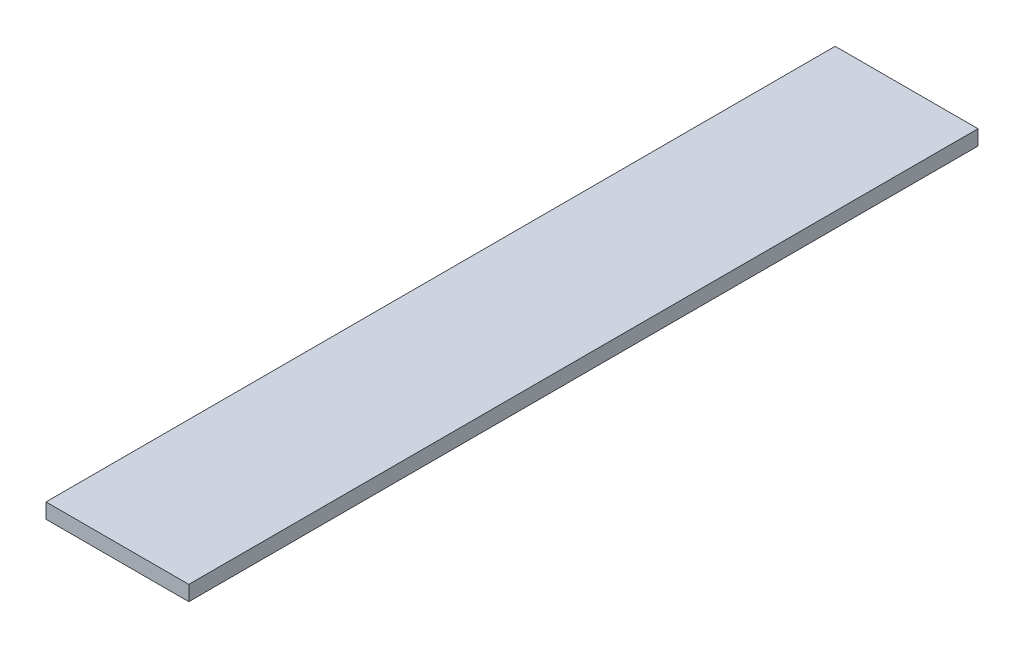
ISO-10303-21;
HEADER;
FILE_DESCRIPTION(('STEP AP214'),'2;1');
FILE_NAME('part.step','',(''),(''),'','','');
FILE_SCHEMA(('AUTOMOTIVE_DESIGN { 1 0 10303 214 1 1 1 1 }'));
ENDSEC;
DATA;
#1=APPLICATION_CONTEXT('core data for automotive mechanical design processes');
#2=APPLICATION_PROTOCOL_DEFINITION('international standard','automotive_design',2000,#1);
#3=PRODUCT_CONTEXT('',#1,'mechanical');
#4=PRODUCT('Part','Part','',(#3));
#5=PRODUCT_RELATED_PRODUCT_CATEGORY('part','',(#4));
#6=PRODUCT_DEFINITION_FORMATION('','',#4);
#7=PRODUCT_DEFINITION_CONTEXT('part definition',#1,'design');
#8=PRODUCT_DEFINITION('design','',#6,#7);
#9=PRODUCT_DEFINITION_SHAPE('','',#8);
#10=(LENGTH_UNIT() NAMED_UNIT(*) SI_UNIT(.MILLI.,.METRE.));
#11=(NAMED_UNIT(*) PLANE_ANGLE_UNIT() SI_UNIT($,.RADIAN.));
#12=(NAMED_UNIT(*) SI_UNIT($,.STERADIAN.) SOLID_ANGLE_UNIT());
#13=UNCERTAINTY_MEASURE_WITH_UNIT(LENGTH_MEASURE(1.E-05),#10,'distance_accuracy_value','');
#14=(GEOMETRIC_REPRESENTATION_CONTEXT(3) GLOBAL_UNCERTAINTY_ASSIGNED_CONTEXT((#13)) GLOBAL_UNIT_ASSIGNED_CONTEXT((#10,
#11,#12)) REPRESENTATION_CONTEXT('',''));
#15=CARTESIAN_POINT('',(0.,0.,0.));
#16=DIRECTION('',(0.,0.,1.));
#17=DIRECTION('',(1.,0.,0.));
#18=AXIS2_PLACEMENT_3D('',#15,#16,#17);
#19=CARTESIAN_POINT('',(-26.82875,14.049375,133.35));
#20=DIRECTION('',(1.,0.,0.));
#21=DIRECTION('',(0.,0.,-1.));
#22=AXIS2_PLACEMENT_3D('',#19,#20,#21);
#23=PLANE('',#22);
#24=DIRECTION('',(0.,-1.,0.));
#25=VECTOR('',#24,1.);
#26=CARTESIAN_POINT('',(-26.82875,14.049375,0.));
#27=LINE('',#26,#25);
#28=CARTESIAN_POINT('',(-26.82875,14.049375,0.));
#29=VERTEX_POINT('',#28);
#30=CARTESIAN_POINT('',(-26.82875,11.509375,0.));
#31=VERTEX_POINT('',#30);
#32=EDGE_CURVE('E113',#29,#31,#27,.T.);
#33=ORIENTED_EDGE('',*,*,#32,.T.);
#34=DIRECTION('',(0.,0.,-1.));
#35=VECTOR('',#34,1.);
#36=CARTESIAN_POINT('',(-26.82875,11.509375,133.35));
#37=LINE('',#36,#35);
#38=CARTESIAN_POINT('',(-26.82875,11.509375,133.35));
#39=VERTEX_POINT('',#38);
#40=EDGE_CURVE('E11',#39,#31,#37,.T.);
#41=ORIENTED_EDGE('',*,*,#40,.F.);
#42=DIRECTION('',(0.,-1.,0.));
#43=VECTOR('',#42,1.);
#44=CARTESIAN_POINT('',(-26.82875,14.049375,133.35));
#45=LINE('',#44,#43);
#46=CARTESIAN_POINT('',(-26.82875,14.049375,133.35));
#47=VERTEX_POINT('',#46);
#48=EDGE_CURVE('E97',#47,#39,#45,.T.);
#49=ORIENTED_EDGE('',*,*,#48,.F.);
#50=DIRECTION('',(0.,0.,-1.));
#51=VECTOR('',#50,1.);
#52=CARTESIAN_POINT('',(-26.82875,14.049375,133.35));
#53=LINE('',#52,#51);
#54=EDGE_CURVE('E109',#47,#29,#53,.T.);
#55=ORIENTED_EDGE('',*,*,#54,.T.);
#56=EDGE_LOOP('',(#33,#41,#49,#55));
#57=FACE_BOUND('',#56,.T.);
#58=ADVANCED_FACE('F45',(#57),#23,.F.);
#59=CARTESIAN_POINT('',(-26.82875,11.509375,133.35));
#60=DIRECTION('',(0.,1.,0.));
#61=DIRECTION('',(0.,0.,1.));
#62=AXIS2_PLACEMENT_3D('',#59,#60,#61);
#63=PLANE('',#62);
#64=DIRECTION('',(1.,0.,0.));
#65=VECTOR('',#64,1.);
#66=CARTESIAN_POINT('',(-26.82875,11.509375,0.));
#67=LINE('',#66,#65);
#68=CARTESIAN_POINT('',(-2.69874999999998,11.509375,0.));
#69=VERTEX_POINT('',#68);
#70=EDGE_CURVE('E102',#31,#69,#67,.T.);
#71=ORIENTED_EDGE('',*,*,#70,.T.);
#72=DIRECTION('',(0.,0.,-1.));
#73=VECTOR('',#72,1.);
#74=CARTESIAN_POINT('',(-2.69874999999998,11.509375,133.35));
#75=LINE('',#74,#73);
#76=CARTESIAN_POINT('',(-2.69874999999998,11.509375,133.35));
#77=VERTEX_POINT('',#76);
#78=EDGE_CURVE('E54',#77,#69,#75,.T.);
#79=ORIENTED_EDGE('',*,*,#78,.F.);
#80=DIRECTION('',(1.,0.,0.));
#81=VECTOR('',#80,1.);
#82=CARTESIAN_POINT('',(-26.82875,11.509375,133.35));
#83=LINE('',#82,#81);
#84=EDGE_CURVE('E92',#39,#77,#83,.T.);
#85=ORIENTED_EDGE('',*,*,#84,.F.);
#86=ORIENTED_EDGE('',*,*,#40,.T.);
#87=EDGE_LOOP('',(#71,#79,#85,#86));
#88=FACE_BOUND('',#87,.T.);
#89=ADVANCED_FACE('F101',(#88),#63,.F.);
#90=CARTESIAN_POINT('',(-2.69874999999998,14.049375,133.35));
#91=DIRECTION('',(-1.,0.,0.));
#92=DIRECTION('',(0.,0.,1.));
#93=AXIS2_PLACEMENT_3D('',#90,#91,#92);
#94=PLANE('',#93);
#95=DIRECTION('',(0.,1.,0.));
#96=VECTOR('',#95,1.);
#97=CARTESIAN_POINT('',(-2.69874999999998,14.049375,0.));
#98=LINE('',#97,#96);
#99=CARTESIAN_POINT('',(-2.69874999999998,14.049375,0.));
#100=VERTEX_POINT('',#99);
#101=EDGE_CURVE('E79',#69,#100,#98,.T.);
#102=ORIENTED_EDGE('',*,*,#101,.T.);
#103=DIRECTION('',(0.,0.,-1.));
#104=VECTOR('',#103,1.);
#105=CARTESIAN_POINT('',(-2.69874999999998,14.049375,133.35));
#106=LINE('',#105,#104);
#107=CARTESIAN_POINT('',(-2.69874999999998,14.049375,133.35));
#108=VERTEX_POINT('',#107);
#109=EDGE_CURVE('E104',#108,#100,#106,.T.);
#110=ORIENTED_EDGE('',*,*,#109,.F.);
#111=DIRECTION('',(0.,1.,0.));
#112=VECTOR('',#111,1.);
#113=CARTESIAN_POINT('',(-2.69874999999998,14.049375,133.35));
#114=LINE('',#113,#112);
#115=EDGE_CURVE('E95',#77,#108,#114,.T.);
#116=ORIENTED_EDGE('',*,*,#115,.F.);
#117=ORIENTED_EDGE('',*,*,#78,.T.);
#118=EDGE_LOOP('',(#102,#110,#116,#117));
#119=FACE_BOUND('',#118,.T.);
#120=ADVANCED_FACE('F105',(#119),#94,.F.);
#121=CARTESIAN_POINT('',(-26.82875,14.049375,133.35));
#122=DIRECTION('',(0.,-1.,0.));
#123=DIRECTION('',(0.,0.,-1.));
#124=AXIS2_PLACEMENT_3D('',#121,#122,#123);
#125=PLANE('',#124);
#126=DIRECTION('',(-1.,0.,0.));
#127=VECTOR('',#126,1.);
#128=CARTESIAN_POINT('',(-26.82875,14.049375,0.));
#129=LINE('',#128,#127);
#130=EDGE_CURVE('E85',#100,#29,#129,.T.);
#131=ORIENTED_EDGE('',*,*,#130,.T.);
#132=ORIENTED_EDGE('',*,*,#54,.F.);
#133=DIRECTION('',(-1.,0.,0.));
#134=VECTOR('',#133,1.);
#135=CARTESIAN_POINT('',(-26.82875,14.049375,133.35));
#136=LINE('',#135,#134);
#137=EDGE_CURVE('E62',#108,#47,#136,.T.);
#138=ORIENTED_EDGE('',*,*,#137,.F.);
#139=ORIENTED_EDGE('',*,*,#109,.T.);
#140=EDGE_LOOP('',(#131,#132,#138,#139));
#141=FACE_BOUND('',#140,.T.);
#142=ADVANCED_FACE('F126',(#141),#125,.F.);
#143=CARTESIAN_POINT('',(0.,0.,133.35));
#144=DIRECTION('',(0.,0.,1.));
#145=DIRECTION('',(1.,0.,0.));
#146=AXIS2_PLACEMENT_3D('',#143,#144,#145);
#147=PLANE('',#146);
#148=ORIENTED_EDGE('',*,*,#48,.T.);
#149=ORIENTED_EDGE('',*,*,#84,.T.);
#150=ORIENTED_EDGE('',*,*,#115,.T.);
#151=ORIENTED_EDGE('',*,*,#137,.T.);
#152=EDGE_LOOP('',(#148,#149,#150,#151));
#153=FACE_BOUND('',#152,.T.);
#154=ADVANCED_FACE('F93',(#153),#147,.T.);
#155=CARTESIAN_POINT('',(0.,0.,0.));
#156=DIRECTION('',(0.,0.,1.));
#157=DIRECTION('',(1.,0.,0.));
#158=AXIS2_PLACEMENT_3D('',#155,#156,#157);
#159=PLANE('',#158);
#160=ORIENTED_EDGE('',*,*,#32,.F.);
#161=ORIENTED_EDGE('',*,*,#130,.F.);
#162=ORIENTED_EDGE('',*,*,#101,.F.);
#163=ORIENTED_EDGE('',*,*,#70,.F.);
#164=EDGE_LOOP('',(#160,#161,#162,#163));
#165=FACE_BOUND('',#164,.T.);
#166=ADVANCED_FACE('F129',(#165),#159,.F.);
#167=CLOSED_SHELL('',(#58,#89,#120,#142,#154,#166));
#168=MANIFOLD_SOLID_BREP('B2',#167);
#169=ADVANCED_BREP_SHAPE_REPRESENTATION('',(#18,#168),#14);
#170=SHAPE_DEFINITION_REPRESENTATION(#9,#169);
ENDSEC;
END-ISO-10303-21;
